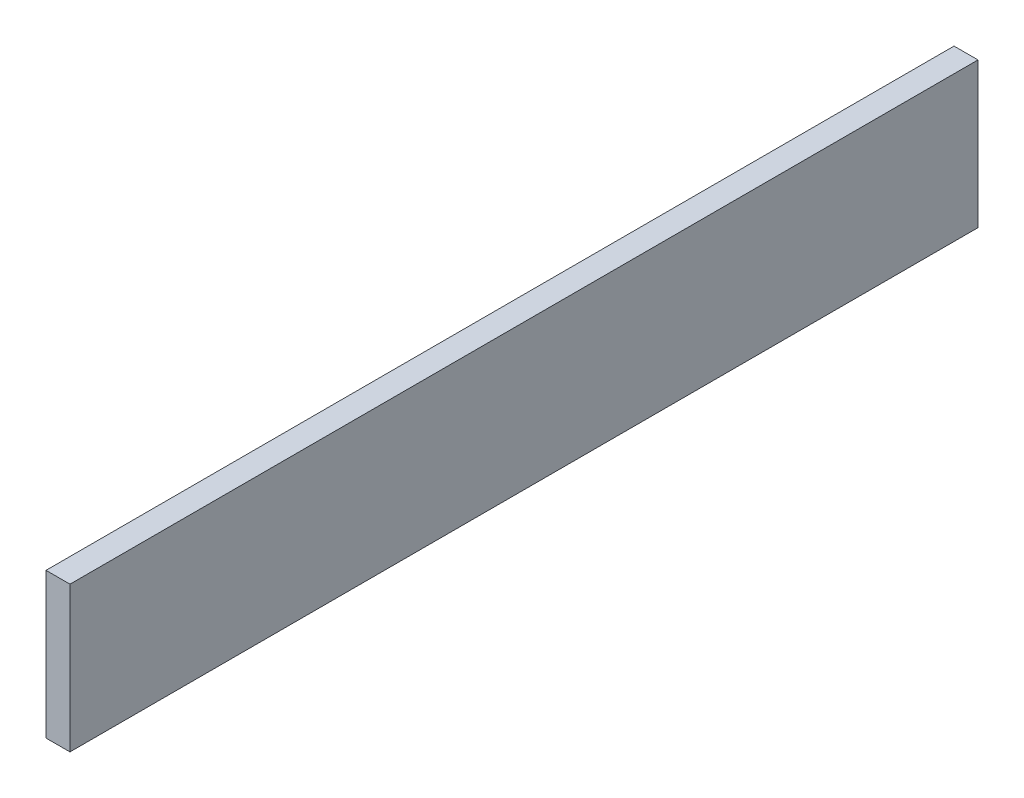
ISO-10303-21;
HEADER;
FILE_DESCRIPTION(('STEP AP214'),'2;1');
FILE_NAME('part.step','',(''),(''),'','','');
FILE_SCHEMA(('AUTOMOTIVE_DESIGN { 1 0 10303 214 1 1 1 1 }'));
ENDSEC;
DATA;
#1=APPLICATION_CONTEXT('core data for automotive mechanical design processes');
#2=APPLICATION_PROTOCOL_DEFINITION('international standard','automotive_design',2000,#1);
#3=PRODUCT_CONTEXT('',#1,'mechanical');
#4=PRODUCT('Part','Part','',(#3));
#5=PRODUCT_RELATED_PRODUCT_CATEGORY('part','',(#4));
#6=PRODUCT_DEFINITION_FORMATION('','',#4);
#7=PRODUCT_DEFINITION_CONTEXT('part definition',#1,'design');
#8=PRODUCT_DEFINITION('design','',#6,#7);
#9=PRODUCT_DEFINITION_SHAPE('','',#8);
#10=(LENGTH_UNIT() NAMED_UNIT(*) SI_UNIT(.MILLI.,.METRE.));
#11=(NAMED_UNIT(*) PLANE_ANGLE_UNIT() SI_UNIT($,.RADIAN.));
#12=(NAMED_UNIT(*) SI_UNIT($,.STERADIAN.) SOLID_ANGLE_UNIT());
#13=UNCERTAINTY_MEASURE_WITH_UNIT(LENGTH_MEASURE(1.E-05),#10,'distance_accuracy_value','');
#14=(GEOMETRIC_REPRESENTATION_CONTEXT(3) GLOBAL_UNCERTAINTY_ASSIGNED_CONTEXT((#13)) GLOBAL_UNIT_ASSIGNED_CONTEXT((#10,
#11,#12)) REPRESENTATION_CONTEXT('',''));
#15=CARTESIAN_POINT('',(0.,0.,0.));
#16=DIRECTION('',(0.,0.,1.));
#17=DIRECTION('',(1.,0.,0.));
#18=AXIS2_PLACEMENT_3D('',#15,#16,#17);
#19=CARTESIAN_POINT('',(9.9,-60.,-750.));
#20=DIRECTION('',(1.,0.,0.));
#21=DIRECTION('',(0.,0.,-1.));
#22=AXIS2_PLACEMENT_3D('',#19,#20,#21);
#23=PLANE('',#22);
#24=DIRECTION('',(0.,1.,0.));
#25=VECTOR('',#24,1.);
#26=CARTESIAN_POINT('',(9.9,-60.,0.));
#27=LINE('',#26,#25);
#28=CARTESIAN_POINT('',(9.9,-60.,0.));
#29=VERTEX_POINT('',#28);
#30=CARTESIAN_POINT('',(9.9,60.,0.));
#31=VERTEX_POINT('',#30);
#32=EDGE_CURVE('E98',#29,#31,#27,.T.);
#33=ORIENTED_EDGE('',*,*,#32,.F.);
#34=DIRECTION('',(0.,0.,1.));
#35=VECTOR('',#34,1.);
#36=CARTESIAN_POINT('',(9.9,-60.,-750.));
#37=LINE('',#36,#35);
#38=CARTESIAN_POINT('',(9.9,-60.,-750.));
#39=VERTEX_POINT('',#38);
#40=EDGE_CURVE('E11',#39,#29,#37,.T.);
#41=ORIENTED_EDGE('',*,*,#40,.F.);
#42=DIRECTION('',(0.,1.,0.));
#43=VECTOR('',#42,1.);
#44=CARTESIAN_POINT('',(9.9,-60.,-750.));
#45=LINE('',#44,#43);
#46=CARTESIAN_POINT('',(9.9,60.,-750.));
#47=VERTEX_POINT('',#46);
#48=EDGE_CURVE('E92',#39,#47,#45,.T.);
#49=ORIENTED_EDGE('',*,*,#48,.T.);
#50=DIRECTION('',(0.,0.,1.));
#51=VECTOR('',#50,1.);
#52=CARTESIAN_POINT('',(9.9,60.,-750.));
#53=LINE('',#52,#51);
#54=EDGE_CURVE('E37',#47,#31,#53,.T.);
#55=ORIENTED_EDGE('',*,*,#54,.T.);
#56=EDGE_LOOP('',(#33,#41,#49,#55));
#57=FACE_BOUND('',#56,.T.);
#58=ADVANCED_FACE('F34',(#57),#23,.T.);
#59=CARTESIAN_POINT('',(-9.9,-60.,-750.));
#60=DIRECTION('',(0.,-1.,0.));
#61=DIRECTION('',(0.,0.,-1.));
#62=AXIS2_PLACEMENT_3D('',#59,#60,#61);
#63=PLANE('',#62);
#64=DIRECTION('',(1.,0.,0.));
#65=VECTOR('',#64,1.);
#66=CARTESIAN_POINT('',(-9.9,-60.,0.));
#67=LINE('',#66,#65);
#68=CARTESIAN_POINT('',(-9.9,-60.,0.));
#69=VERTEX_POINT('',#68);
#70=EDGE_CURVE('E94',#69,#29,#67,.T.);
#71=ORIENTED_EDGE('',*,*,#70,.F.);
#72=DIRECTION('',(0.,0.,1.));
#73=VECTOR('',#72,1.);
#74=CARTESIAN_POINT('',(-9.9,-60.,-750.));
#75=LINE('',#74,#73);
#76=CARTESIAN_POINT('',(-9.9,-60.,-750.));
#77=VERTEX_POINT('',#76);
#78=EDGE_CURVE('E43',#77,#69,#75,.T.);
#79=ORIENTED_EDGE('',*,*,#78,.F.);
#80=DIRECTION('',(1.,0.,0.));
#81=VECTOR('',#80,1.);
#82=CARTESIAN_POINT('',(-9.9,-60.,-750.));
#83=LINE('',#82,#81);
#84=EDGE_CURVE('E89',#77,#39,#83,.T.);
#85=ORIENTED_EDGE('',*,*,#84,.T.);
#86=ORIENTED_EDGE('',*,*,#40,.T.);
#87=EDGE_LOOP('',(#71,#79,#85,#86));
#88=FACE_BOUND('',#87,.T.);
#89=ADVANCED_FACE('F108',(#88),#63,.T.);
#90=CARTESIAN_POINT('',(-9.9,-60.,-750.));
#91=DIRECTION('',(-1.,0.,0.));
#92=DIRECTION('',(0.,0.,1.));
#93=AXIS2_PLACEMENT_3D('',#90,#91,#92);
#94=PLANE('',#93);
#95=DIRECTION('',(0.,-1.,0.));
#96=VECTOR('',#95,1.);
#97=CARTESIAN_POINT('',(-9.9,-60.,0.));
#98=LINE('',#97,#96);
#99=CARTESIAN_POINT('',(-9.9,60.,0.));
#100=VERTEX_POINT('',#99);
#101=EDGE_CURVE('E84',#100,#69,#98,.T.);
#102=ORIENTED_EDGE('',*,*,#101,.F.);
#103=DIRECTION('',(0.,0.,1.));
#104=VECTOR('',#103,1.);
#105=CARTESIAN_POINT('',(-9.9,60.,-750.));
#106=LINE('',#105,#104);
#107=CARTESIAN_POINT('',(-9.9,60.,-750.));
#108=VERTEX_POINT('',#107);
#109=EDGE_CURVE('E79',#108,#100,#106,.T.);
#110=ORIENTED_EDGE('',*,*,#109,.F.);
#111=DIRECTION('',(0.,-1.,0.));
#112=VECTOR('',#111,1.);
#113=CARTESIAN_POINT('',(-9.9,-60.,-750.));
#114=LINE('',#113,#112);
#115=EDGE_CURVE('E82',#108,#77,#114,.T.);
#116=ORIENTED_EDGE('',*,*,#115,.T.);
#117=ORIENTED_EDGE('',*,*,#78,.T.);
#118=EDGE_LOOP('',(#102,#110,#116,#117));
#119=FACE_BOUND('',#118,.T.);
#120=ADVANCED_FACE('F81',(#119),#94,.T.);
#121=CARTESIAN_POINT('',(-9.9,60.,-750.));
#122=DIRECTION('',(0.,1.,0.));
#123=DIRECTION('',(0.,0.,1.));
#124=AXIS2_PLACEMENT_3D('',#121,#122,#123);
#125=PLANE('',#124);
#126=DIRECTION('',(-1.,0.,0.));
#127=VECTOR('',#126,1.);
#128=CARTESIAN_POINT('',(-9.9,60.,0.));
#129=LINE('',#128,#127);
#130=EDGE_CURVE('E101',#31,#100,#129,.T.);
#131=ORIENTED_EDGE('',*,*,#130,.F.);
#132=ORIENTED_EDGE('',*,*,#54,.F.);
#133=DIRECTION('',(-1.,0.,0.));
#134=VECTOR('',#133,1.);
#135=CARTESIAN_POINT('',(-9.9,60.,-750.));
#136=LINE('',#135,#134);
#137=EDGE_CURVE('E88',#47,#108,#136,.T.);
#138=ORIENTED_EDGE('',*,*,#137,.T.);
#139=ORIENTED_EDGE('',*,*,#109,.T.);
#140=EDGE_LOOP('',(#131,#132,#138,#139));
#141=FACE_BOUND('',#140,.T.);
#142=ADVANCED_FACE('F91',(#141),#125,.T.);
#143=CARTESIAN_POINT('',(0.,0.,-750.));
#144=DIRECTION('',(0.,0.,-1.));
#145=DIRECTION('',(-1.,0.,0.));
#146=AXIS2_PLACEMENT_3D('',#143,#144,#145);
#147=PLANE('',#146);
#148=ORIENTED_EDGE('',*,*,#48,.F.);
#149=ORIENTED_EDGE('',*,*,#84,.F.);
#150=ORIENTED_EDGE('',*,*,#115,.F.);
#151=ORIENTED_EDGE('',*,*,#137,.F.);
#152=EDGE_LOOP('',(#148,#149,#150,#151));
#153=FACE_BOUND('',#152,.T.);
#154=ADVANCED_FACE('F87',(#153),#147,.T.);
#155=CARTESIAN_POINT('',(0.,0.,0.));
#156=DIRECTION('',(0.,0.,-1.));
#157=DIRECTION('',(-1.,0.,0.));
#158=AXIS2_PLACEMENT_3D('',#155,#156,#157);
#159=PLANE('',#158);
#160=ORIENTED_EDGE('',*,*,#32,.T.);
#161=ORIENTED_EDGE('',*,*,#130,.T.);
#162=ORIENTED_EDGE('',*,*,#101,.T.);
#163=ORIENTED_EDGE('',*,*,#70,.T.);
#164=EDGE_LOOP('',(#160,#161,#162,#163));
#165=FACE_BOUND('',#164,.T.);
#166=ADVANCED_FACE('F107',(#165),#159,.F.);
#167=CLOSED_SHELL('',(#58,#89,#120,#142,#154,#166));
#168=MANIFOLD_SOLID_BREP('B2',#167);
#169=ADVANCED_BREP_SHAPE_REPRESENTATION('',(#18,#168),#14);
#170=SHAPE_DEFINITION_REPRESENTATION(#9,#169);
ENDSEC;
END-ISO-10303-21;
